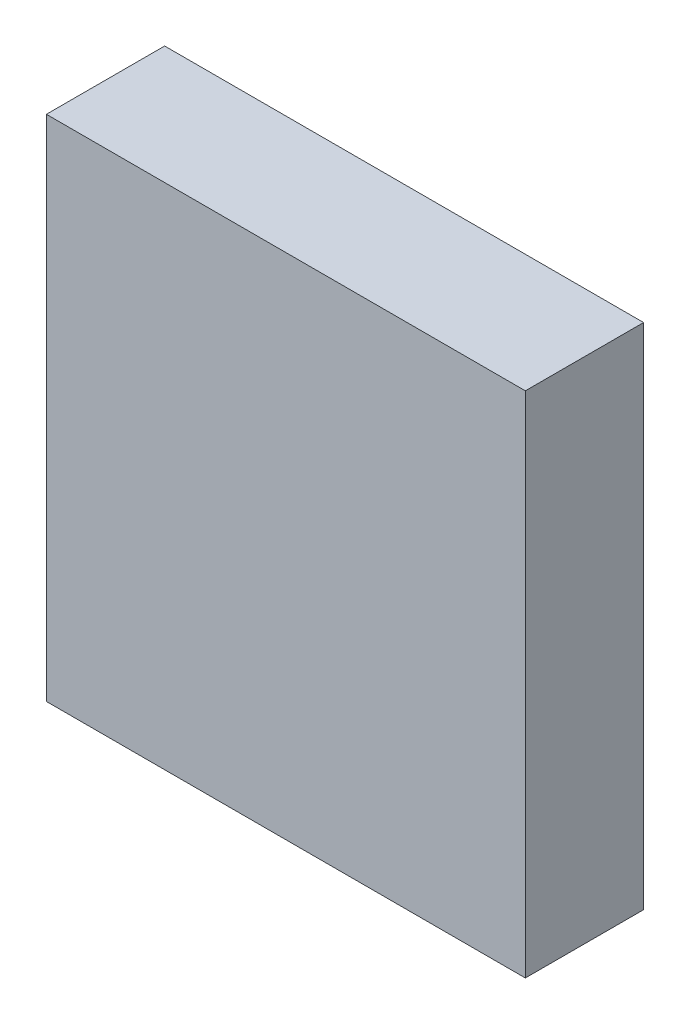
ISO-10303-21;
HEADER;
FILE_DESCRIPTION(('STEP AP214'),'2;1');
FILE_NAME('part.step','',(''),(''),'','','');
FILE_SCHEMA(('AUTOMOTIVE_DESIGN { 1 0 10303 214 1 1 1 1 }'));
ENDSEC;
DATA;
#1=APPLICATION_CONTEXT('core data for automotive mechanical design processes');
#2=APPLICATION_PROTOCOL_DEFINITION('international standard','automotive_design',2000,#1);
#3=PRODUCT_CONTEXT('',#1,'mechanical');
#4=PRODUCT('Part','Part','',(#3));
#5=PRODUCT_RELATED_PRODUCT_CATEGORY('part','',(#4));
#6=PRODUCT_DEFINITION_FORMATION('','',#4);
#7=PRODUCT_DEFINITION_CONTEXT('part definition',#1,'design');
#8=PRODUCT_DEFINITION('design','',#6,#7);
#9=PRODUCT_DEFINITION_SHAPE('','',#8);
#10=(LENGTH_UNIT() NAMED_UNIT(*) SI_UNIT(.MILLI.,.METRE.));
#11=(NAMED_UNIT(*) PLANE_ANGLE_UNIT() SI_UNIT($,.RADIAN.));
#12=(NAMED_UNIT(*) SI_UNIT($,.STERADIAN.) SOLID_ANGLE_UNIT());
#13=UNCERTAINTY_MEASURE_WITH_UNIT(LENGTH_MEASURE(1.E-05),#10,'distance_accuracy_value','');
#14=(GEOMETRIC_REPRESENTATION_CONTEXT(3) GLOBAL_UNCERTAINTY_ASSIGNED_CONTEXT((#13)) GLOBAL_UNIT_ASSIGNED_CONTEXT((#10,
#11,#12)) REPRESENTATION_CONTEXT('',''));
#15=CARTESIAN_POINT('',(0.,0.,0.));
#16=DIRECTION('',(0.,0.,1.));
#17=DIRECTION('',(1.,0.,0.));
#18=AXIS2_PLACEMENT_3D('',#15,#16,#17);
#19=CARTESIAN_POINT('',(40.5,-43.,20.));
#20=DIRECTION('',(-1.,0.,0.));
#21=DIRECTION('',(0.,0.,1.));
#22=AXIS2_PLACEMENT_3D('',#19,#20,#21);
#23=PLANE('',#22);
#24=DIRECTION('',(0.,1.,0.));
#25=VECTOR('',#24,1.);
#26=CARTESIAN_POINT('',(40.5,-43.,0.));
#27=LINE('',#26,#25);
#28=CARTESIAN_POINT('',(40.5,-43.,0.));
#29=VERTEX_POINT('',#28);
#30=CARTESIAN_POINT('',(40.5,43.,0.));
#31=VERTEX_POINT('',#30);
#32=EDGE_CURVE('E96',#29,#31,#27,.T.);
#33=ORIENTED_EDGE('',*,*,#32,.T.);
#34=DIRECTION('',(0.,0.,-1.));
#35=VECTOR('',#34,1.);
#36=CARTESIAN_POINT('',(40.5,43.,20.));
#37=LINE('',#36,#35);
#38=CARTESIAN_POINT('',(40.5,43.,20.));
#39=VERTEX_POINT('',#38);
#40=EDGE_CURVE('E11',#39,#31,#37,.T.);
#41=ORIENTED_EDGE('',*,*,#40,.F.);
#42=DIRECTION('',(0.,1.,0.));
#43=VECTOR('',#42,1.);
#44=CARTESIAN_POINT('',(40.5,-43.,20.));
#45=LINE('',#44,#43);
#46=CARTESIAN_POINT('',(40.5,-43.,20.));
#47=VERTEX_POINT('',#46);
#48=EDGE_CURVE('E84',#47,#39,#45,.T.);
#49=ORIENTED_EDGE('',*,*,#48,.F.);
#50=DIRECTION('',(0.,0.,-1.));
#51=VECTOR('',#50,1.);
#52=CARTESIAN_POINT('',(40.5,-43.,20.));
#53=LINE('',#52,#51);
#54=EDGE_CURVE('E92',#47,#29,#53,.T.);
#55=ORIENTED_EDGE('',*,*,#54,.T.);
#56=EDGE_LOOP('',(#33,#41,#49,#55));
#57=FACE_BOUND('',#56,.T.);
#58=ADVANCED_FACE('F33',(#57),#23,.F.);
#59=CARTESIAN_POINT('',(-40.5,43.,20.));
#60=DIRECTION('',(0.,-1.,0.));
#61=DIRECTION('',(0.,0.,-1.));
#62=AXIS2_PLACEMENT_3D('',#59,#60,#61);
#63=PLANE('',#62);
#64=DIRECTION('',(-1.,0.,0.));
#65=VECTOR('',#64,1.);
#66=CARTESIAN_POINT('',(-40.5,43.,0.));
#67=LINE('',#66,#65);
#68=CARTESIAN_POINT('',(-40.5,43.,0.));
#69=VERTEX_POINT('',#68);
#70=EDGE_CURVE('E88',#31,#69,#67,.T.);
#71=ORIENTED_EDGE('',*,*,#70,.T.);
#72=DIRECTION('',(0.,0.,-1.));
#73=VECTOR('',#72,1.);
#74=CARTESIAN_POINT('',(-40.5,43.,20.));
#75=LINE('',#74,#73);
#76=CARTESIAN_POINT('',(-40.5,43.,20.));
#77=VERTEX_POINT('',#76);
#78=EDGE_CURVE('E41',#77,#69,#75,.T.);
#79=ORIENTED_EDGE('',*,*,#78,.F.);
#80=DIRECTION('',(-1.,0.,0.));
#81=VECTOR('',#80,1.);
#82=CARTESIAN_POINT('',(-40.5,43.,20.));
#83=LINE('',#82,#81);
#84=EDGE_CURVE('E79',#39,#77,#83,.T.);
#85=ORIENTED_EDGE('',*,*,#84,.F.);
#86=ORIENTED_EDGE('',*,*,#40,.T.);
#87=EDGE_LOOP('',(#71,#79,#85,#86));
#88=FACE_BOUND('',#87,.T.);
#89=ADVANCED_FACE('F87',(#88),#63,.F.);
#90=CARTESIAN_POINT('',(-40.5,-43.,20.));
#91=DIRECTION('',(1.,0.,0.));
#92=DIRECTION('',(0.,0.,-1.));
#93=AXIS2_PLACEMENT_3D('',#90,#91,#92);
#94=PLANE('',#93);
#95=DIRECTION('',(0.,-1.,0.));
#96=VECTOR('',#95,1.);
#97=CARTESIAN_POINT('',(-40.5,-43.,0.));
#98=LINE('',#97,#96);
#99=CARTESIAN_POINT('',(-40.5,-43.,0.));
#100=VERTEX_POINT('',#99);
#101=EDGE_CURVE('E66',#69,#100,#98,.T.);
#102=ORIENTED_EDGE('',*,*,#101,.T.);
#103=DIRECTION('',(0.,0.,-1.));
#104=VECTOR('',#103,1.);
#105=CARTESIAN_POINT('',(-40.5,-43.,20.));
#106=LINE('',#105,#104);
#107=CARTESIAN_POINT('',(-40.5,-43.,20.));
#108=VERTEX_POINT('',#107);
#109=EDGE_CURVE('E89',#108,#100,#106,.T.);
#110=ORIENTED_EDGE('',*,*,#109,.F.);
#111=DIRECTION('',(0.,-1.,0.));
#112=VECTOR('',#111,1.);
#113=CARTESIAN_POINT('',(-40.5,-43.,20.));
#114=LINE('',#113,#112);
#115=EDGE_CURVE('E82',#77,#108,#114,.T.);
#116=ORIENTED_EDGE('',*,*,#115,.F.);
#117=ORIENTED_EDGE('',*,*,#78,.T.);
#118=EDGE_LOOP('',(#102,#110,#116,#117));
#119=FACE_BOUND('',#118,.T.);
#120=ADVANCED_FACE('F90',(#119),#94,.F.);
#121=CARTESIAN_POINT('',(-40.5,-43.,20.));
#122=DIRECTION('',(0.,1.,0.));
#123=DIRECTION('',(0.,0.,1.));
#124=AXIS2_PLACEMENT_3D('',#121,#122,#123);
#125=PLANE('',#124);
#126=DIRECTION('',(1.,0.,0.));
#127=VECTOR('',#126,1.);
#128=CARTESIAN_POINT('',(-40.5,-43.,0.));
#129=LINE('',#128,#127);
#130=EDGE_CURVE('E72',#100,#29,#129,.T.);
#131=ORIENTED_EDGE('',*,*,#130,.T.);
#132=ORIENTED_EDGE('',*,*,#54,.F.);
#133=DIRECTION('',(1.,0.,0.));
#134=VECTOR('',#133,1.);
#135=CARTESIAN_POINT('',(-40.5,-43.,20.));
#136=LINE('',#135,#134);
#137=EDGE_CURVE('E49',#108,#47,#136,.T.);
#138=ORIENTED_EDGE('',*,*,#137,.F.);
#139=ORIENTED_EDGE('',*,*,#109,.T.);
#140=EDGE_LOOP('',(#131,#132,#138,#139));
#141=FACE_BOUND('',#140,.T.);
#142=ADVANCED_FACE('F103',(#141),#125,.F.);
#143=CARTESIAN_POINT('',(0.,0.,20.));
#144=DIRECTION('',(0.,0.,-1.));
#145=DIRECTION('',(-1.,0.,0.));
#146=AXIS2_PLACEMENT_3D('',#143,#144,#145);
#147=PLANE('',#146);
#148=ORIENTED_EDGE('',*,*,#48,.T.);
#149=ORIENTED_EDGE('',*,*,#84,.T.);
#150=ORIENTED_EDGE('',*,*,#115,.T.);
#151=ORIENTED_EDGE('',*,*,#137,.T.);
#152=EDGE_LOOP('',(#148,#149,#150,#151));
#153=FACE_BOUND('',#152,.T.);
#154=ADVANCED_FACE('F80',(#153),#147,.F.);
#155=CARTESIAN_POINT('',(0.,0.,0.));
#156=DIRECTION('',(0.,0.,-1.));
#157=DIRECTION('',(-1.,0.,0.));
#158=AXIS2_PLACEMENT_3D('',#155,#156,#157);
#159=PLANE('',#158);
#160=ORIENTED_EDGE('',*,*,#32,.F.);
#161=ORIENTED_EDGE('',*,*,#130,.F.);
#162=ORIENTED_EDGE('',*,*,#101,.F.);
#163=ORIENTED_EDGE('',*,*,#70,.F.);
#164=EDGE_LOOP('',(#160,#161,#162,#163));
#165=FACE_BOUND('',#164,.T.);
#166=ADVANCED_FACE('F106',(#165),#159,.T.);
#167=CLOSED_SHELL('',(#58,#89,#120,#142,#154,#166));
#168=MANIFOLD_SOLID_BREP('B2',#167);
#169=ADVANCED_BREP_SHAPE_REPRESENTATION('',(#18,#168),#14);
#170=SHAPE_DEFINITION_REPRESENTATION(#9,#169);
ENDSEC;
END-ISO-10303-21;
